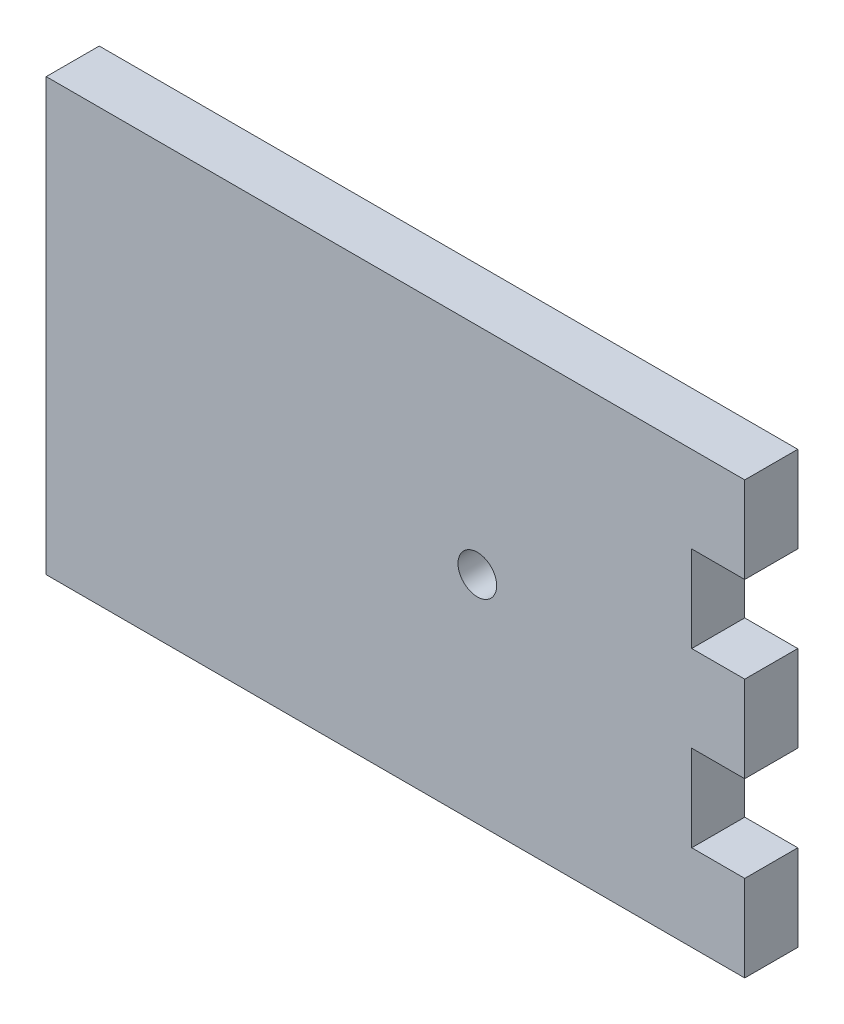
ISO-10303-21;
HEADER;
FILE_DESCRIPTION(('STEP AP214'),'2;1');
FILE_NAME('part.step','',(''),(''),'','','');
FILE_SCHEMA(('AUTOMOTIVE_DESIGN { 1 0 10303 214 1 1 1 1 }'));
ENDSEC;
DATA;
#1=APPLICATION_CONTEXT('core data for automotive mechanical design processes');
#2=APPLICATION_PROTOCOL_DEFINITION('international standard','automotive_design',2000,#1);
#3=PRODUCT_CONTEXT('',#1,'mechanical');
#4=PRODUCT('Part','Part','',(#3));
#5=PRODUCT_RELATED_PRODUCT_CATEGORY('part','',(#4));
#6=PRODUCT_DEFINITION_FORMATION('','',#4);
#7=PRODUCT_DEFINITION_CONTEXT('part definition',#1,'design');
#8=PRODUCT_DEFINITION('design','',#6,#7);
#9=PRODUCT_DEFINITION_SHAPE('','',#8);
#10=(LENGTH_UNIT() NAMED_UNIT(*) SI_UNIT(.MILLI.,.METRE.));
#11=(NAMED_UNIT(*) PLANE_ANGLE_UNIT() SI_UNIT($,.RADIAN.));
#12=(NAMED_UNIT(*) SI_UNIT($,.STERADIAN.) SOLID_ANGLE_UNIT());
#13=UNCERTAINTY_MEASURE_WITH_UNIT(LENGTH_MEASURE(1.E-05),#10,'distance_accuracy_value','');
#14=(GEOMETRIC_REPRESENTATION_CONTEXT(3) GLOBAL_UNCERTAINTY_ASSIGNED_CONTEXT((#13)) GLOBAL_UNIT_ASSIGNED_CONTEXT((#10,
#11,#12)) REPRESENTATION_CONTEXT('',''));
#15=CARTESIAN_POINT('',(0.,0.,0.));
#16=DIRECTION('',(0.,0.,1.));
#17=DIRECTION('',(1.,0.,0.));
#18=AXIS2_PLACEMENT_3D('',#15,#16,#17);
#19=CARTESIAN_POINT('',(63.246,0.,4.800000052));
#20=DIRECTION('',(-1.,0.,0.));
#21=DIRECTION('',(0.,0.,1.));
#22=AXIS2_PLACEMENT_3D('',#19,#20,#21);
#23=PLANE('',#22);
#24=DIRECTION('',(0.,0.,1.));
#25=VECTOR('',#24,1.);
#26=CARTESIAN_POINT('',(63.246,7.8117192,0.));
#27=LINE('',#26,#25);
#28=CARTESIAN_POINT('',(63.246,7.8117192,0.));
#29=VERTEX_POINT('',#28);
#30=CARTESIAN_POINT('',(63.246,7.8117192,4.800000052));
#31=VERTEX_POINT('',#30);
#32=EDGE_CURVE('E56',#29,#31,#27,.T.);
#33=ORIENTED_EDGE('',*,*,#32,.T.);
#34=DIRECTION('',(0.,1.,0.));
#35=VECTOR('',#34,1.);
#36=CARTESIAN_POINT('',(63.246,0.,4.800000052));
#37=LINE('',#36,#35);
#38=CARTESIAN_POINT('',(63.246,0.,4.800000052));
#39=VERTEX_POINT('',#38);
#40=EDGE_CURVE('E190',#39,#31,#37,.T.);
#41=ORIENTED_EDGE('',*,*,#40,.F.);
#42=DIRECTION('',(0.,0.,-1.));
#43=VECTOR('',#42,1.);
#44=CARTESIAN_POINT('',(63.246,0.,4.800000052));
#45=LINE('',#44,#43);
#46=CARTESIAN_POINT('',(63.246,0.,0.));
#47=VERTEX_POINT('',#46);
#48=EDGE_CURVE('E41',#39,#47,#45,.T.);
#49=ORIENTED_EDGE('',*,*,#48,.T.);
#50=DIRECTION('',(0.,1.,0.));
#51=VECTOR('',#50,1.);
#52=CARTESIAN_POINT('',(63.246,0.,0.));
#53=LINE('',#52,#51);
#54=EDGE_CURVE('E202',#47,#29,#53,.T.);
#55=ORIENTED_EDGE('',*,*,#54,.T.);
#56=EDGE_LOOP('',(#33,#41,#49,#55));
#57=FACE_BOUND('',#56,.T.);
#58=ADVANCED_FACE('F33',(#57),#23,.F.);
#59=CARTESIAN_POINT('',(63.246,15.6234384,4.800000052));
#60=VERTEX_POINT('',#59);
#61=CARTESIAN_POINT('',(63.246,23.4351576,4.800000052));
#62=VERTEX_POINT('',#61);
#63=EDGE_CURVE('E194',#60,#62,#37,.T.);
#64=ORIENTED_EDGE('',*,*,#63,.F.);
#65=DIRECTION('',(0.,0.,1.));
#66=VECTOR('',#65,1.);
#67=CARTESIAN_POINT('',(63.246,15.6234384,0.));
#68=LINE('',#67,#66);
#69=CARTESIAN_POINT('',(63.246,15.6234384,0.));
#70=VERTEX_POINT('',#69);
#71=EDGE_CURVE('E157',#70,#60,#68,.T.);
#72=ORIENTED_EDGE('',*,*,#71,.F.);
#73=CARTESIAN_POINT('',(63.246,23.4351576,0.));
#74=VERTEX_POINT('',#73);
#75=EDGE_CURVE('E204',#70,#74,#53,.T.);
#76=ORIENTED_EDGE('',*,*,#75,.T.);
#77=DIRECTION('',(0.,0.,1.));
#78=VECTOR('',#77,1.);
#79=CARTESIAN_POINT('',(63.246,23.4351576,0.));
#80=LINE('',#79,#78);
#81=EDGE_CURVE('E48',#74,#62,#80,.T.);
#82=ORIENTED_EDGE('',*,*,#81,.T.);
#83=EDGE_LOOP('',(#64,#72,#76,#82));
#84=FACE_BOUND('',#83,.T.);
#85=ADVANCED_FACE('F234',(#84),#23,.F.);
#86=CARTESIAN_POINT('',(0.,0.,4.800000052));
#87=DIRECTION('',(1.,0.,0.));
#88=DIRECTION('',(0.,0.,-1.));
#89=AXIS2_PLACEMENT_3D('',#86,#87,#88);
#90=PLANE('',#89);
#91=DIRECTION('',(0.,-1.,0.));
#92=VECTOR('',#91,1.);
#93=CARTESIAN_POINT('',(0.,0.,0.));
#94=LINE('',#93,#92);
#95=CARTESIAN_POINT('',(0.,39.058596,0.));
#96=VERTEX_POINT('',#95);
#97=CARTESIAN_POINT('',(0.,0.,0.));
#98=VERTEX_POINT('',#97);
#99=EDGE_CURVE('E156',#96,#98,#94,.T.);
#100=ORIENTED_EDGE('',*,*,#99,.T.);
#101=DIRECTION('',(0.,0.,-1.));
#102=VECTOR('',#101,1.);
#103=CARTESIAN_POINT('',(0.,0.,4.800000052));
#104=LINE('',#103,#102);
#105=CARTESIAN_POINT('',(0.,0.,4.800000052));
#106=VERTEX_POINT('',#105);
#107=EDGE_CURVE('E11',#106,#98,#104,.T.);
#108=ORIENTED_EDGE('',*,*,#107,.F.);
#109=DIRECTION('',(0.,-1.,0.));
#110=VECTOR('',#109,1.);
#111=CARTESIAN_POINT('',(0.,0.,4.800000052));
#112=LINE('',#111,#110);
#113=CARTESIAN_POINT('',(0.,39.058596,4.800000052));
#114=VERTEX_POINT('',#113);
#115=EDGE_CURVE('E183',#114,#106,#112,.T.);
#116=ORIENTED_EDGE('',*,*,#115,.F.);
#117=DIRECTION('',(0.,0.,-1.));
#118=VECTOR('',#117,1.);
#119=CARTESIAN_POINT('',(0.,39.058596,4.800000052));
#120=LINE('',#119,#118);
#121=EDGE_CURVE('E196',#114,#96,#120,.T.);
#122=ORIENTED_EDGE('',*,*,#121,.T.);
#123=EDGE_LOOP('',(#100,#108,#116,#122));
#124=FACE_BOUND('',#123,.T.);
#125=ADVANCED_FACE('F35',(#124),#90,.F.);
#126=CARTESIAN_POINT('',(0.,0.,4.800000052));
#127=DIRECTION('',(0.,1.,0.));
#128=DIRECTION('',(0.,0.,1.));
#129=AXIS2_PLACEMENT_3D('',#126,#127,#128);
#130=PLANE('',#129);
#131=DIRECTION('',(1.,0.,0.));
#132=VECTOR('',#131,1.);
#133=CARTESIAN_POINT('',(0.,0.,0.));
#134=LINE('',#133,#132);
#135=EDGE_CURVE('E199',#98,#47,#134,.T.);
#136=ORIENTED_EDGE('',*,*,#135,.T.);
#137=ORIENTED_EDGE('',*,*,#48,.F.);
#138=DIRECTION('',(1.,0.,0.));
#139=VECTOR('',#138,1.);
#140=CARTESIAN_POINT('',(0.,0.,4.800000052));
#141=LINE('',#140,#139);
#142=EDGE_CURVE('E186',#106,#39,#141,.T.);
#143=ORIENTED_EDGE('',*,*,#142,.F.);
#144=ORIENTED_EDGE('',*,*,#107,.T.);
#145=EDGE_LOOP('',(#136,#137,#143,#144));
#146=FACE_BOUND('',#145,.T.);
#147=ADVANCED_FACE('F218',(#146),#130,.F.);
#148=CARTESIAN_POINT('',(63.246,31.2468768,4.800000052));
#149=VERTEX_POINT('',#148);
#150=CARTESIAN_POINT('',(63.246,39.058596,4.800000052));
#151=VERTEX_POINT('',#150);
#152=EDGE_CURVE('E189',#149,#151,#37,.T.);
#153=ORIENTED_EDGE('',*,*,#152,.F.);
#154=DIRECTION('',(0.,0.,1.));
#155=VECTOR('',#154,1.);
#156=CARTESIAN_POINT('',(63.246,31.2468768,0.));
#157=LINE('',#156,#155);
#158=CARTESIAN_POINT('',(63.246,31.2468768,0.));
#159=VERTEX_POINT('',#158);
#160=EDGE_CURVE('E179',#159,#149,#157,.T.);
#161=ORIENTED_EDGE('',*,*,#160,.F.);
#162=CARTESIAN_POINT('',(63.246,39.058596,0.));
#163=VERTEX_POINT('',#162);
#164=EDGE_CURVE('E201',#159,#163,#53,.T.);
#165=ORIENTED_EDGE('',*,*,#164,.T.);
#166=DIRECTION('',(0.,0.,-1.));
#167=VECTOR('',#166,1.);
#168=CARTESIAN_POINT('',(63.246,39.058596,4.800000052));
#169=LINE('',#168,#167);
#170=EDGE_CURVE('E208',#151,#163,#169,.T.);
#171=ORIENTED_EDGE('',*,*,#170,.F.);
#172=EDGE_LOOP('',(#153,#161,#165,#171));
#173=FACE_BOUND('',#172,.T.);
#174=ADVANCED_FACE('F247',(#173),#23,.F.);
#175=CARTESIAN_POINT('',(0.,39.058596,4.800000052));
#176=DIRECTION('',(0.,-1.,0.));
#177=DIRECTION('',(0.,0.,-1.));
#178=AXIS2_PLACEMENT_3D('',#175,#176,#177);
#179=PLANE('',#178);
#180=DIRECTION('',(-1.,0.,0.));
#181=VECTOR('',#180,1.);
#182=CARTESIAN_POINT('',(0.,39.058596,0.));
#183=LINE('',#182,#181);
#184=EDGE_CURVE('E187',#163,#96,#183,.T.);
#185=ORIENTED_EDGE('',*,*,#184,.T.);
#186=ORIENTED_EDGE('',*,*,#121,.F.);
#187=DIRECTION('',(-1.,0.,0.));
#188=VECTOR('',#187,1.);
#189=CARTESIAN_POINT('',(0.,39.058596,4.800000052));
#190=LINE('',#189,#188);
#191=EDGE_CURVE('E193',#151,#114,#190,.T.);
#192=ORIENTED_EDGE('',*,*,#191,.F.);
#193=ORIENTED_EDGE('',*,*,#170,.T.);
#194=EDGE_LOOP('',(#185,#186,#192,#193));
#195=FACE_BOUND('',#194,.T.);
#196=ADVANCED_FACE('F224',(#195),#179,.F.);
#197=CARTESIAN_POINT('',(0.,0.,4.800000052));
#198=DIRECTION('',(0.,0.,-1.));
#199=DIRECTION('',(-1.,0.,0.));
#200=AXIS2_PLACEMENT_3D('',#197,#198,#199);
#201=PLANE('',#200);
#202=CARTESIAN_POINT('',(39.032113706,19.529298,4.800000052));
#203=DIRECTION('',(0.,0.,1.));
#204=DIRECTION('',(1.,0.,0.));
#205=AXIS2_PLACEMENT_3D('',#202,#203,#204);
#206=CIRCLE('',#205,1.750000056);
#207=CARTESIAN_POINT('',(40.782113762,19.529298,4.800000052));
#208=VERTEX_POINT('',#207);
#209=EDGE_CURVE('E147',#208,#208,#206,.T.);
#210=ORIENTED_EDGE('',*,*,#209,.F.);
#211=EDGE_LOOP('',(#210));
#212=FACE_BOUND('',#211,.T.);
#213=DIRECTION('',(0.,1.,0.));
#214=VECTOR('',#213,1.);
#215=CARTESIAN_POINT('',(58.445999948,0.,4.800000052));
#216=LINE('',#215,#214);
#217=CARTESIAN_POINT('',(58.445999948,7.8117192,4.800000052));
#218=VERTEX_POINT('',#217);
#219=CARTESIAN_POINT('',(58.445999948,15.6234384,4.800000052));
#220=VERTEX_POINT('',#219);
#221=EDGE_CURVE('E135',#218,#220,#216,.T.);
#222=ORIENTED_EDGE('',*,*,#221,.T.);
#223=DIRECTION('',(-1.,0.,0.));
#224=VECTOR('',#223,1.);
#225=CARTESIAN_POINT('',(0.,15.6234384,4.800000052));
#226=LINE('',#225,#224);
#227=EDGE_CURVE('E141',#60,#220,#226,.T.);
#228=ORIENTED_EDGE('',*,*,#227,.F.);
#229=ORIENTED_EDGE('',*,*,#63,.T.);
#230=DIRECTION('',(-1.,0.,0.));
#231=VECTOR('',#230,1.);
#232=CARTESIAN_POINT('',(0.,23.4351576,4.800000052));
#233=LINE('',#232,#231);
#234=CARTESIAN_POINT('',(58.445999948,23.4351576,4.800000052));
#235=VERTEX_POINT('',#234);
#236=EDGE_CURVE('E172',#62,#235,#233,.T.);
#237=ORIENTED_EDGE('',*,*,#236,.T.);
#238=DIRECTION('',(0.,1.,0.));
#239=VECTOR('',#238,1.);
#240=CARTESIAN_POINT('',(58.445999948,0.,4.800000052));
#241=LINE('',#240,#239);
#242=CARTESIAN_POINT('',(58.445999948,31.2468768,4.800000052));
#243=VERTEX_POINT('',#242);
#244=EDGE_CURVE('E169',#235,#243,#241,.T.);
#245=ORIENTED_EDGE('',*,*,#244,.T.);
#246=DIRECTION('',(-1.,0.,0.));
#247=VECTOR('',#246,1.);
#248=CARTESIAN_POINT('',(0.,31.2468768,4.800000052));
#249=LINE('',#248,#247);
#250=EDGE_CURVE('E163',#149,#243,#249,.T.);
#251=ORIENTED_EDGE('',*,*,#250,.F.);
#252=ORIENTED_EDGE('',*,*,#152,.T.);
#253=ORIENTED_EDGE('',*,*,#191,.T.);
#254=ORIENTED_EDGE('',*,*,#115,.T.);
#255=ORIENTED_EDGE('',*,*,#142,.T.);
#256=ORIENTED_EDGE('',*,*,#40,.T.);
#257=DIRECTION('',(-1.,0.,0.));
#258=VECTOR('',#257,1.);
#259=CARTESIAN_POINT('',(0.,7.81171919999999,4.800000052));
#260=LINE('',#259,#258);
#261=EDGE_CURVE('E144',#31,#218,#260,.T.);
#262=ORIENTED_EDGE('',*,*,#261,.T.);
#263=EDGE_LOOP('',(#222,#228,#229,#237,#245,#251,#252,#253,#254,#255,#256,#262));
#264=FACE_BOUND('',#263,.T.);
#265=ADVANCED_FACE('F244',(#212,#264),#201,.F.);
#266=CARTESIAN_POINT('',(0.,0.,0.));
#267=DIRECTION('',(0.,0.,-1.));
#268=DIRECTION('',(-1.,0.,0.));
#269=AXIS2_PLACEMENT_3D('',#266,#267,#268);
#270=PLANE('',#269);
#271=CARTESIAN_POINT('',(39.032113706,19.529298,0.));
#272=DIRECTION('',(0.,0.,1.));
#273=DIRECTION('',(1.,0.,0.));
#274=AXIS2_PLACEMENT_3D('',#271,#272,#273);
#275=CIRCLE('',#274,1.750000056);
#276=CARTESIAN_POINT('',(40.782113762,19.529298,0.));
#277=VERTEX_POINT('',#276);
#278=EDGE_CURVE('E173',#277,#277,#275,.T.);
#279=ORIENTED_EDGE('',*,*,#278,.T.);
#280=EDGE_LOOP('',(#279));
#281=FACE_BOUND('',#280,.T.);
#282=DIRECTION('',(-1.,0.,0.));
#283=VECTOR('',#282,1.);
#284=CARTESIAN_POINT('',(0.,15.6234384,0.));
#285=LINE('',#284,#283);
#286=CARTESIAN_POINT('',(58.445999948,15.6234384,0.));
#287=VERTEX_POINT('',#286);
#288=EDGE_CURVE('E128',#70,#287,#285,.T.);
#289=ORIENTED_EDGE('',*,*,#288,.T.);
#290=DIRECTION('',(0.,1.,0.));
#291=VECTOR('',#290,1.);
#292=CARTESIAN_POINT('',(58.445999948,0.,0.));
#293=LINE('',#292,#291);
#294=CARTESIAN_POINT('',(58.445999948,7.8117192,0.));
#295=VERTEX_POINT('',#294);
#296=EDGE_CURVE('E129',#295,#287,#293,.T.);
#297=ORIENTED_EDGE('',*,*,#296,.F.);
#298=DIRECTION('',(-1.,0.,0.));
#299=VECTOR('',#298,1.);
#300=CARTESIAN_POINT('',(0.,7.81171919999999,0.));
#301=LINE('',#300,#299);
#302=EDGE_CURVE('E119',#29,#295,#301,.T.);
#303=ORIENTED_EDGE('',*,*,#302,.F.);
#304=ORIENTED_EDGE('',*,*,#54,.F.);
#305=ORIENTED_EDGE('',*,*,#135,.F.);
#306=ORIENTED_EDGE('',*,*,#99,.F.);
#307=ORIENTED_EDGE('',*,*,#184,.F.);
#308=ORIENTED_EDGE('',*,*,#164,.F.);
#309=DIRECTION('',(-1.,0.,0.));
#310=VECTOR('',#309,1.);
#311=CARTESIAN_POINT('',(0.,31.2468768,0.));
#312=LINE('',#311,#310);
#313=CARTESIAN_POINT('',(58.445999948,31.2468768,0.));
#314=VERTEX_POINT('',#313);
#315=EDGE_CURVE('E165',#159,#314,#312,.T.);
#316=ORIENTED_EDGE('',*,*,#315,.T.);
#317=DIRECTION('',(0.,1.,0.));
#318=VECTOR('',#317,1.);
#319=CARTESIAN_POINT('',(58.445999948,0.,0.));
#320=LINE('',#319,#318);
#321=CARTESIAN_POINT('',(58.445999948,23.4351576,0.));
#322=VERTEX_POINT('',#321);
#323=EDGE_CURVE('E160',#322,#314,#320,.T.);
#324=ORIENTED_EDGE('',*,*,#323,.F.);
#325=DIRECTION('',(-1.,0.,0.));
#326=VECTOR('',#325,1.);
#327=CARTESIAN_POINT('',(0.,23.4351576,0.));
#328=LINE('',#327,#326);
#329=EDGE_CURVE('E162',#74,#322,#328,.T.);
#330=ORIENTED_EDGE('',*,*,#329,.F.);
#331=ORIENTED_EDGE('',*,*,#75,.F.);
#332=EDGE_LOOP('',(#289,#297,#303,#304,#305,#306,#307,#308,#316,#324,#330,#331));
#333=FACE_BOUND('',#332,.T.);
#334=ADVANCED_FACE('F139',(#281,#333),#270,.T.);
#335=CARTESIAN_POINT('',(58.445999948,0.,0.));
#336=DIRECTION('',(1.,0.,0.));
#337=DIRECTION('',(0.,0.,-1.));
#338=AXIS2_PLACEMENT_3D('',#335,#336,#337);
#339=PLANE('',#338);
#340=ORIENTED_EDGE('',*,*,#244,.F.);
#341=DIRECTION('',(0.,0.,1.));
#342=VECTOR('',#341,1.);
#343=CARTESIAN_POINT('',(58.445999948,23.4351576,0.));
#344=LINE('',#343,#342);
#345=EDGE_CURVE('E168',#322,#235,#344,.T.);
#346=ORIENTED_EDGE('',*,*,#345,.F.);
#347=ORIENTED_EDGE('',*,*,#323,.T.);
#348=DIRECTION('',(0.,0.,1.));
#349=VECTOR('',#348,1.);
#350=CARTESIAN_POINT('',(58.445999948,31.2468768,0.));
#351=LINE('',#350,#349);
#352=EDGE_CURVE('E152',#314,#243,#351,.T.);
#353=ORIENTED_EDGE('',*,*,#352,.T.);
#354=EDGE_LOOP('',(#340,#346,#347,#353));
#355=FACE_BOUND('',#354,.T.);
#356=ADVANCED_FACE('F240',(#355),#339,.T.);
#357=CARTESIAN_POINT('',(0.,31.2468768,0.));
#358=DIRECTION('',(0.,1.,0.));
#359=DIRECTION('',(-1.,0.,0.));
#360=AXIS2_PLACEMENT_3D('',#357,#358,#359);
#361=PLANE('',#360);
#362=ORIENTED_EDGE('',*,*,#250,.T.);
#363=ORIENTED_EDGE('',*,*,#352,.F.);
#364=ORIENTED_EDGE('',*,*,#315,.F.);
#365=ORIENTED_EDGE('',*,*,#160,.T.);
#366=EDGE_LOOP('',(#362,#363,#364,#365));
#367=FACE_BOUND('',#366,.T.);
#368=ADVANCED_FACE('F298',(#367),#361,.F.);
#369=CARTESIAN_POINT('',(0.,23.4351576,0.));
#370=DIRECTION('',(0.,1.,0.));
#371=DIRECTION('',(0.,0.,1.));
#372=AXIS2_PLACEMENT_3D('',#369,#370,#371);
#373=PLANE('',#372);
#374=ORIENTED_EDGE('',*,*,#236,.F.);
#375=ORIENTED_EDGE('',*,*,#81,.F.);
#376=ORIENTED_EDGE('',*,*,#329,.T.);
#377=ORIENTED_EDGE('',*,*,#345,.T.);
#378=EDGE_LOOP('',(#374,#375,#376,#377));
#379=FACE_BOUND('',#378,.T.);
#380=ADVANCED_FACE('F237',(#379),#373,.T.);
#381=CARTESIAN_POINT('',(58.445999948,0.,0.));
#382=DIRECTION('',(1.,0.,0.));
#383=DIRECTION('',(0.,0.,-1.));
#384=AXIS2_PLACEMENT_3D('',#381,#382,#383);
#385=PLANE('',#384);
#386=ORIENTED_EDGE('',*,*,#221,.F.);
#387=DIRECTION('',(0.,0.,1.));
#388=VECTOR('',#387,1.);
#389=CARTESIAN_POINT('',(58.445999948,7.8117192,0.));
#390=LINE('',#389,#388);
#391=EDGE_CURVE('E122',#295,#218,#390,.T.);
#392=ORIENTED_EDGE('',*,*,#391,.F.);
#393=ORIENTED_EDGE('',*,*,#296,.T.);
#394=DIRECTION('',(0.,0.,1.));
#395=VECTOR('',#394,1.);
#396=CARTESIAN_POINT('',(58.445999948,15.6234384,0.));
#397=LINE('',#396,#395);
#398=EDGE_CURVE('E154',#287,#220,#397,.T.);
#399=ORIENTED_EDGE('',*,*,#398,.T.);
#400=EDGE_LOOP('',(#386,#392,#393,#399));
#401=FACE_BOUND('',#400,.T.);
#402=ADVANCED_FACE('F132',(#401),#385,.T.);
#403=CARTESIAN_POINT('',(0.,15.6234384,0.));
#404=DIRECTION('',(0.,1.,0.));
#405=DIRECTION('',(0.,0.,1.));
#406=AXIS2_PLACEMENT_3D('',#403,#404,#405);
#407=PLANE('',#406);
#408=ORIENTED_EDGE('',*,*,#227,.T.);
#409=ORIENTED_EDGE('',*,*,#398,.F.);
#410=ORIENTED_EDGE('',*,*,#288,.F.);
#411=ORIENTED_EDGE('',*,*,#71,.T.);
#412=EDGE_LOOP('',(#408,#409,#410,#411));
#413=FACE_BOUND('',#412,.T.);
#414=ADVANCED_FACE('F325',(#413),#407,.F.);
#415=CARTESIAN_POINT('',(0.,7.81171919999999,0.));
#416=DIRECTION('',(0.,1.,0.));
#417=DIRECTION('',(-1.,0.,0.));
#418=AXIS2_PLACEMENT_3D('',#415,#416,#417);
#419=PLANE('',#418);
#420=ORIENTED_EDGE('',*,*,#261,.F.);
#421=ORIENTED_EDGE('',*,*,#32,.F.);
#422=ORIENTED_EDGE('',*,*,#302,.T.);
#423=ORIENTED_EDGE('',*,*,#391,.T.);
#424=EDGE_LOOP('',(#420,#421,#422,#423));
#425=FACE_BOUND('',#424,.T.);
#426=ADVANCED_FACE('F121',(#425),#419,.T.);
#427=CARTESIAN_POINT('',(39.032113706,19.529298,0.));
#428=DIRECTION('',(0.,0.,1.));
#429=DIRECTION('',(1.,0.,0.));
#430=AXIS2_PLACEMENT_3D('',#427,#428,#429);
#431=CYLINDRICAL_SURFACE('',#430,1.750000056);
#432=ORIENTED_EDGE('',*,*,#278,.F.);
#433=EDGE_LOOP('',(#432));
#434=FACE_BOUND('',#433,.T.);
#435=ORIENTED_EDGE('',*,*,#209,.T.);
#436=EDGE_LOOP('',(#435));
#437=FACE_BOUND('',#436,.T.);
#438=ADVANCED_FACE('F343',(#434,#437),#431,.F.);
#439=CLOSED_SHELL('',(#58,#85,#125,#147,#174,#196,#265,#334,#356,#368,#380,#402,#414,#426,#438));
#440=MANIFOLD_SOLID_BREP('B2',#439);
#441=ADVANCED_BREP_SHAPE_REPRESENTATION('',(#18,#440),#14);
#442=SHAPE_DEFINITION_REPRESENTATION(#9,#441);
ENDSEC;
END-ISO-10303-21;
